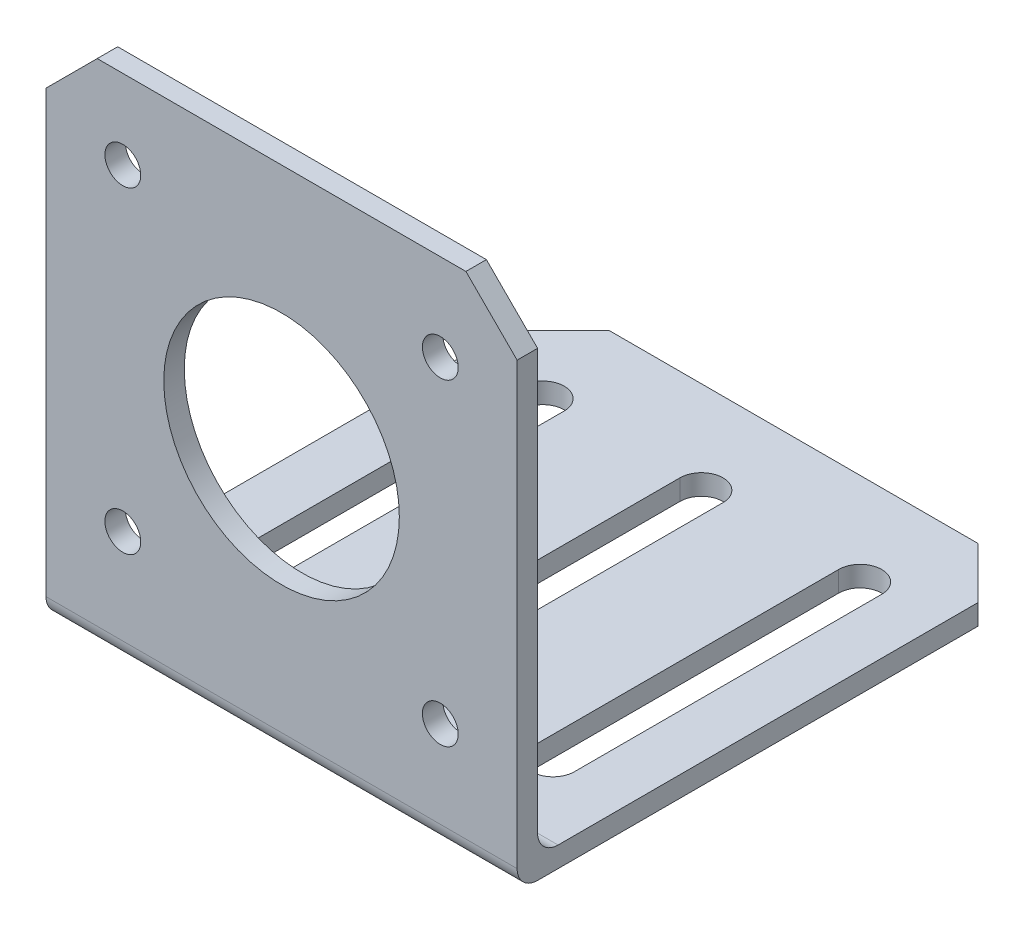
ISO-10303-21;
HEADER;
FILE_DESCRIPTION(('STEP AP214'),'2;1');
FILE_NAME('part.step','',(''),(''),'','','');
FILE_SCHEMA(('AUTOMOTIVE_DESIGN { 1 0 10303 214 1 1 1 1 }'));
ENDSEC;
DATA;
#1=APPLICATION_CONTEXT('core data for automotive mechanical design processes');
#2=APPLICATION_PROTOCOL_DEFINITION('international standard','automotive_design',2000,#1);
#3=PRODUCT_CONTEXT('',#1,'mechanical');
#4=PRODUCT('Part','Part','',(#3));
#5=PRODUCT_RELATED_PRODUCT_CATEGORY('part','',(#4));
#6=PRODUCT_DEFINITION_FORMATION('','',#4);
#7=PRODUCT_DEFINITION_CONTEXT('part definition',#1,'design');
#8=PRODUCT_DEFINITION('design','',#6,#7);
#9=PRODUCT_DEFINITION_SHAPE('','',#8);
#10=(LENGTH_UNIT() NAMED_UNIT(*) SI_UNIT(.MILLI.,.METRE.));
#11=(NAMED_UNIT(*) PLANE_ANGLE_UNIT() SI_UNIT($,.RADIAN.));
#12=(NAMED_UNIT(*) SI_UNIT($,.STERADIAN.) SOLID_ANGLE_UNIT());
#13=UNCERTAINTY_MEASURE_WITH_UNIT(LENGTH_MEASURE(1.E-05),#10,'distance_accuracy_value','');
#14=(GEOMETRIC_REPRESENTATION_CONTEXT(3) GLOBAL_UNCERTAINTY_ASSIGNED_CONTEXT((#13)) GLOBAL_UNIT_ASSIGNED_CONTEXT((#10,
#11,#12)) REPRESENTATION_CONTEXT('',''));
#15=CARTESIAN_POINT('',(0.,0.,0.));
#16=DIRECTION('',(0.,0.,1.));
#17=DIRECTION('',(1.,0.,0.));
#18=AXIS2_PLACEMENT_3D('',#15,#16,#17);
#19=CARTESIAN_POINT('',(46.,2.,-4.));
#20=DIRECTION('',(0.,-1.,0.));
#21=DIRECTION('',(0.,0.,-1.));
#22=AXIS2_PLACEMENT_3D('',#19,#20,#21);
#23=PLANE('',#22);
#24=DIRECTION('',(-1.,0.,0.));
#25=VECTOR('',#24,1.);
#26=CARTESIAN_POINT('',(46.,2.,-50.));
#27=LINE('',#26,#25);
#28=CARTESIAN_POINT('',(41.,2.,-50.));
#29=VERTEX_POINT('',#28);
#30=CARTESIAN_POINT('',(5.,2.,-50.));
#31=VERTEX_POINT('',#30);
#32=EDGE_CURVE('E372',#29,#31,#27,.T.);
#33=ORIENTED_EDGE('',*,*,#32,.T.);
#34=DIRECTION('',(-0.707106781186547,0.,0.707106781186548));
#35=VECTOR('',#34,1.);
#36=CARTESIAN_POINT('',(5.,2.,-50.));
#37=LINE('',#36,#35);
#38=CARTESIAN_POINT('',(0.,2.,-45.));
#39=VERTEX_POINT('',#38);
#40=EDGE_CURVE('E382',#31,#39,#37,.T.);
#41=ORIENTED_EDGE('',*,*,#40,.T.);
#42=DIRECTION('',(0.,0.,1.));
#43=VECTOR('',#42,1.);
#44=CARTESIAN_POINT('',(0.,2.,-4.));
#45=LINE('',#44,#43);
#46=CARTESIAN_POINT('',(0.,2.,-4.));
#47=VERTEX_POINT('',#46);
#48=EDGE_CURVE('E323',#39,#47,#45,.T.);
#49=ORIENTED_EDGE('',*,*,#48,.T.);
#50=DIRECTION('',(-1.,0.,0.));
#51=VECTOR('',#50,1.);
#52=CARTESIAN_POINT('',(46.,2.,-4.));
#53=LINE('',#52,#51);
#54=CARTESIAN_POINT('',(46.,2.,-4.));
#55=VERTEX_POINT('',#54);
#56=EDGE_CURVE('E369',#55,#47,#53,.T.);
#57=ORIENTED_EDGE('',*,*,#56,.F.);
#58=DIRECTION('',(0.,0.,1.));
#59=VECTOR('',#58,1.);
#60=CARTESIAN_POINT('',(46.,2.,-4.));
#61=LINE('',#60,#59);
#62=CARTESIAN_POINT('',(46.,2.,-45.));
#63=VERTEX_POINT('',#62);
#64=EDGE_CURVE('E324',#63,#55,#61,.T.);
#65=ORIENTED_EDGE('',*,*,#64,.F.);
#66=DIRECTION('',(0.707106781186549,0.,0.707106781186547));
#67=VECTOR('',#66,1.);
#68=CARTESIAN_POINT('',(46.,2.,-45.));
#69=LINE('',#68,#67);
#70=EDGE_CURVE('E380',#63,#29,#69,.F.);
#71=ORIENTED_EDGE('',*,*,#70,.T.);
#72=EDGE_LOOP('',(#33,#41,#49,#57,#65,#71));
#73=FACE_BOUND('',#72,.T.);
#74=DIRECTION('',(0.,0.,1.));
#75=VECTOR('',#74,1.);
#76=CARTESIAN_POINT('',(9.6,2.,-4.));
#77=LINE('',#76,#75);
#78=CARTESIAN_POINT('',(9.6,2.,-41.));
#79=VERTEX_POINT('',#78);
#80=CARTESIAN_POINT('',(9.6,2.,-11.));
#81=VERTEX_POINT('',#80);
#82=EDGE_CURVE('E287',#79,#81,#77,.T.);
#83=ORIENTED_EDGE('',*,*,#82,.T.);
#84=CARTESIAN_POINT('',(7.5,2.,-11.));
#85=DIRECTION('',(0.,-1.,0.));
#86=DIRECTION('',(0.,0.,-1.));
#87=AXIS2_PLACEMENT_3D('',#84,#85,#86);
#88=CIRCLE('',#87,2.1);
#89=CARTESIAN_POINT('',(5.4,2.,-11.));
#90=VERTEX_POINT('',#89);
#91=EDGE_CURVE('E290',#81,#90,#88,.T.);
#92=ORIENTED_EDGE('',*,*,#91,.T.);
#93=DIRECTION('',(0.,0.,-1.));
#94=VECTOR('',#93,1.);
#95=CARTESIAN_POINT('',(5.4,2.,-4.));
#96=LINE('',#95,#94);
#97=CARTESIAN_POINT('',(5.4,2.,-41.));
#98=VERTEX_POINT('',#97);
#99=EDGE_CURVE('E275',#90,#98,#96,.T.);
#100=ORIENTED_EDGE('',*,*,#99,.T.);
#101=CARTESIAN_POINT('',(7.5,2.,-41.));
#102=DIRECTION('',(0.,-1.,0.));
#103=DIRECTION('',(0.,0.,-1.));
#104=AXIS2_PLACEMENT_3D('',#101,#102,#103);
#105=CIRCLE('',#104,2.1);
#106=EDGE_CURVE('E284',#98,#79,#105,.T.);
#107=ORIENTED_EDGE('',*,*,#106,.T.);
#108=EDGE_LOOP('',(#83,#92,#100,#107));
#109=FACE_BOUND('',#108,.T.);
#110=DIRECTION('',(0.,0.,1.));
#111=VECTOR('',#110,1.);
#112=CARTESIAN_POINT('',(40.6,2.,-4.));
#113=LINE('',#112,#111);
#114=CARTESIAN_POINT('',(40.6,2.,-41.));
#115=VERTEX_POINT('',#114);
#116=CARTESIAN_POINT('',(40.6,2.,-11.));
#117=VERTEX_POINT('',#116);
#118=EDGE_CURVE('E255',#115,#117,#113,.T.);
#119=ORIENTED_EDGE('',*,*,#118,.T.);
#120=CARTESIAN_POINT('',(38.5,2.,-11.));
#121=DIRECTION('',(0.,-1.,0.));
#122=DIRECTION('',(0.,0.,-1.));
#123=AXIS2_PLACEMENT_3D('',#120,#121,#122);
#124=CIRCLE('',#123,2.1);
#125=CARTESIAN_POINT('',(36.4,2.,-11.));
#126=VERTEX_POINT('',#125);
#127=EDGE_CURVE('E258',#117,#126,#124,.T.);
#128=ORIENTED_EDGE('',*,*,#127,.T.);
#129=DIRECTION('',(0.,0.,-1.));
#130=VECTOR('',#129,1.);
#131=CARTESIAN_POINT('',(36.4,2.,-4.));
#132=LINE('',#131,#130);
#133=CARTESIAN_POINT('',(36.4,2.,-41.));
#134=VERTEX_POINT('',#133);
#135=EDGE_CURVE('E243',#126,#134,#132,.T.);
#136=ORIENTED_EDGE('',*,*,#135,.T.);
#137=CARTESIAN_POINT('',(38.5,2.,-41.));
#138=DIRECTION('',(0.,-1.,0.));
#139=DIRECTION('',(0.,0.,-1.));
#140=AXIS2_PLACEMENT_3D('',#137,#138,#139);
#141=CIRCLE('',#140,2.1);
#142=EDGE_CURVE('E252',#134,#115,#141,.T.);
#143=ORIENTED_EDGE('',*,*,#142,.T.);
#144=EDGE_LOOP('',(#119,#128,#136,#143));
#145=FACE_BOUND('',#144,.T.);
#146=CARTESIAN_POINT('',(23.,2.,-11.));
#147=DIRECTION('',(0.,-1.,0.));
#148=DIRECTION('',(0.,0.,-1.));
#149=AXIS2_PLACEMENT_3D('',#146,#147,#148);
#150=CIRCLE('',#149,2.1);
#151=CARTESIAN_POINT('',(20.9,2.,-11.));
#152=VERTEX_POINT('',#151);
#153=CARTESIAN_POINT('',(25.1,2.,-11.));
#154=VERTEX_POINT('',#153);
#155=EDGE_CURVE('E197',#152,#154,#150,.F.);
#156=ORIENTED_EDGE('',*,*,#155,.F.);
#157=DIRECTION('',(0.,0.,1.));
#158=VECTOR('',#157,1.);
#159=CARTESIAN_POINT('',(20.9,2.,-4.));
#160=LINE('',#159,#158);
#161=CARTESIAN_POINT('',(20.9,2.,-41.));
#162=VERTEX_POINT('',#161);
#163=EDGE_CURVE('E200',#162,#152,#160,.T.);
#164=ORIENTED_EDGE('',*,*,#163,.F.);
#165=CARTESIAN_POINT('',(23.,2.,-41.));
#166=DIRECTION('',(0.,-1.,0.));
#167=DIRECTION('',(0.,0.,-1.));
#168=AXIS2_PLACEMENT_3D('',#165,#166,#167);
#169=CIRCLE('',#168,2.1);
#170=CARTESIAN_POINT('',(25.1,2.,-41.));
#171=VERTEX_POINT('',#170);
#172=EDGE_CURVE('E224',#171,#162,#169,.F.);
#173=ORIENTED_EDGE('',*,*,#172,.F.);
#174=DIRECTION('',(0.,0.,-1.));
#175=VECTOR('',#174,1.);
#176=CARTESIAN_POINT('',(25.1,2.,-4.));
#177=LINE('',#176,#175);
#178=EDGE_CURVE('E226',#154,#171,#177,.T.);
#179=ORIENTED_EDGE('',*,*,#178,.F.);
#180=EDGE_LOOP('',(#156,#164,#173,#179));
#181=FACE_BOUND('',#180,.T.);
#182=ADVANCED_FACE('F34',(#73,#109,#145,#181),#23,.F.);
#183=CARTESIAN_POINT('',(46.,0.,-2.00000000000001));
#184=DIRECTION('',(0.,1.,0.));
#185=DIRECTION('',(0.,0.,1.));
#186=AXIS2_PLACEMENT_3D('',#183,#184,#185);
#187=PLANE('',#186);
#188=DIRECTION('',(0.,0.,-1.));
#189=VECTOR('',#188,1.);
#190=CARTESIAN_POINT('',(0.,0.,-2.00000000000001));
#191=LINE('',#190,#189);
#192=CARTESIAN_POINT('',(0.,0.,-2.00000000000001));
#193=VERTEX_POINT('',#192);
#194=CARTESIAN_POINT('',(0.,0.,-45.));
#195=VERTEX_POINT('',#194);
#196=EDGE_CURVE('E327',#193,#195,#191,.T.);
#197=ORIENTED_EDGE('',*,*,#196,.T.);
#198=DIRECTION('',(0.707106781186547,0.,-0.707106781186548));
#199=VECTOR('',#198,1.);
#200=CARTESIAN_POINT('',(5.,0.,-50.));
#201=LINE('',#200,#199);
#202=CARTESIAN_POINT('',(5.,0.,-50.));
#203=VERTEX_POINT('',#202);
#204=EDGE_CURVE('E390',#195,#203,#201,.T.);
#205=ORIENTED_EDGE('',*,*,#204,.T.);
#206=DIRECTION('',(-1.,0.,0.));
#207=VECTOR('',#206,1.);
#208=CARTESIAN_POINT('',(46.,0.,-50.));
#209=LINE('',#208,#207);
#210=CARTESIAN_POINT('',(41.,0.,-50.));
#211=VERTEX_POINT('',#210);
#212=EDGE_CURVE('E339',#211,#203,#209,.T.);
#213=ORIENTED_EDGE('',*,*,#212,.F.);
#214=DIRECTION('',(-0.707106781186549,0.,-0.707106781186547));
#215=VECTOR('',#214,1.);
#216=CARTESIAN_POINT('',(46.,0.,-45.));
#217=LINE('',#216,#215);
#218=CARTESIAN_POINT('',(46.,0.,-45.));
#219=VERTEX_POINT('',#218);
#220=EDGE_CURVE('E388',#211,#219,#217,.F.);
#221=ORIENTED_EDGE('',*,*,#220,.T.);
#222=DIRECTION('',(0.,0.,-1.));
#223=VECTOR('',#222,1.);
#224=CARTESIAN_POINT('',(46.,0.,-2.00000000000001));
#225=LINE('',#224,#223);
#226=CARTESIAN_POINT('',(46.,0.,-2.00000000000001));
#227=VERTEX_POINT('',#226);
#228=EDGE_CURVE('E336',#227,#219,#225,.T.);
#229=ORIENTED_EDGE('',*,*,#228,.F.);
#230=DIRECTION('',(-1.,0.,0.));
#231=VECTOR('',#230,1.);
#232=CARTESIAN_POINT('',(46.,0.,-2.00000000000001));
#233=LINE('',#232,#231);
#234=EDGE_CURVE('E354',#227,#193,#233,.T.);
#235=ORIENTED_EDGE('',*,*,#234,.T.);
#236=EDGE_LOOP('',(#197,#205,#213,#221,#229,#235));
#237=FACE_BOUND('',#236,.T.);
#238=DIRECTION('',(0.,0.,-1.));
#239=VECTOR('',#238,1.);
#240=CARTESIAN_POINT('',(5.4,0.,-11.));
#241=LINE('',#240,#239);
#242=CARTESIAN_POINT('',(5.4,0.,-11.));
#243=VERTEX_POINT('',#242);
#244=CARTESIAN_POINT('',(5.4,0.,-41.));
#245=VERTEX_POINT('',#244);
#246=EDGE_CURVE('E263',#243,#245,#241,.T.);
#247=ORIENTED_EDGE('',*,*,#246,.F.);
#248=CARTESIAN_POINT('',(7.5,0.,-11.));
#249=DIRECTION('',(0.,-1.,0.));
#250=DIRECTION('',(0.,0.,-1.));
#251=AXIS2_PLACEMENT_3D('',#248,#249,#250);
#252=CIRCLE('',#251,2.1);
#253=CARTESIAN_POINT('',(9.6,0.,-11.));
#254=VERTEX_POINT('',#253);
#255=EDGE_CURVE('E261',#254,#243,#252,.T.);
#256=ORIENTED_EDGE('',*,*,#255,.F.);
#257=DIRECTION('',(0.,0.,1.));
#258=VECTOR('',#257,1.);
#259=CARTESIAN_POINT('',(9.6,0.,-11.));
#260=LINE('',#259,#258);
#261=CARTESIAN_POINT('',(9.6,0.,-41.));
#262=VERTEX_POINT('',#261);
#263=EDGE_CURVE('E269',#262,#254,#260,.T.);
#264=ORIENTED_EDGE('',*,*,#263,.F.);
#265=CARTESIAN_POINT('',(7.5,0.,-41.));
#266=DIRECTION('',(0.,-1.,0.));
#267=DIRECTION('',(0.,0.,-1.));
#268=AXIS2_PLACEMENT_3D('',#265,#266,#267);
#269=CIRCLE('',#268,2.1);
#270=EDGE_CURVE('E266',#245,#262,#269,.T.);
#271=ORIENTED_EDGE('',*,*,#270,.F.);
#272=EDGE_LOOP('',(#247,#256,#264,#271));
#273=FACE_BOUND('',#272,.T.);
#274=DIRECTION('',(0.,0.,-1.));
#275=VECTOR('',#274,1.);
#276=CARTESIAN_POINT('',(36.4,0.,-11.));
#277=LINE('',#276,#275);
#278=CARTESIAN_POINT('',(36.4,0.,-11.));
#279=VERTEX_POINT('',#278);
#280=CARTESIAN_POINT('',(36.4,0.,-41.));
#281=VERTEX_POINT('',#280);
#282=EDGE_CURVE('E231',#279,#281,#277,.T.);
#283=ORIENTED_EDGE('',*,*,#282,.F.);
#284=CARTESIAN_POINT('',(38.5,0.,-11.));
#285=DIRECTION('',(0.,-1.,0.));
#286=DIRECTION('',(0.,0.,-1.));
#287=AXIS2_PLACEMENT_3D('',#284,#285,#286);
#288=CIRCLE('',#287,2.1);
#289=CARTESIAN_POINT('',(40.6,0.,-11.));
#290=VERTEX_POINT('',#289);
#291=EDGE_CURVE('E229',#290,#279,#288,.T.);
#292=ORIENTED_EDGE('',*,*,#291,.F.);
#293=DIRECTION('',(0.,0.,1.));
#294=VECTOR('',#293,1.);
#295=CARTESIAN_POINT('',(40.6,0.,-11.));
#296=LINE('',#295,#294);
#297=CARTESIAN_POINT('',(40.6,0.,-41.));
#298=VERTEX_POINT('',#297);
#299=EDGE_CURVE('E237',#298,#290,#296,.T.);
#300=ORIENTED_EDGE('',*,*,#299,.F.);
#301=CARTESIAN_POINT('',(38.5,0.,-41.));
#302=DIRECTION('',(0.,-1.,0.));
#303=DIRECTION('',(0.,0.,-1.));
#304=AXIS2_PLACEMENT_3D('',#301,#302,#303);
#305=CIRCLE('',#304,2.1);
#306=EDGE_CURVE('E234',#281,#298,#305,.T.);
#307=ORIENTED_EDGE('',*,*,#306,.F.);
#308=EDGE_LOOP('',(#283,#292,#300,#307));
#309=FACE_BOUND('',#308,.T.);
#310=CARTESIAN_POINT('',(23.,0.,-11.));
#311=DIRECTION('',(0.,1.,0.));
#312=DIRECTION('',(0.,0.,1.));
#313=AXIS2_PLACEMENT_3D('',#310,#311,#312);
#314=CIRCLE('',#313,2.1);
#315=CARTESIAN_POINT('',(20.9,0.,-11.));
#316=VERTEX_POINT('',#315);
#317=CARTESIAN_POINT('',(25.1,0.,-11.));
#318=VERTEX_POINT('',#317);
#319=EDGE_CURVE('E57',#316,#318,#314,.T.);
#320=ORIENTED_EDGE('',*,*,#319,.T.);
#321=DIRECTION('',(0.,0.,-1.));
#322=VECTOR('',#321,1.);
#323=CARTESIAN_POINT('',(25.1,0.,-11.));
#324=LINE('',#323,#322);
#325=CARTESIAN_POINT('',(25.1,0.,-41.));
#326=VERTEX_POINT('',#325);
#327=EDGE_CURVE('E204',#318,#326,#324,.T.);
#328=ORIENTED_EDGE('',*,*,#327,.T.);
#329=CARTESIAN_POINT('',(23.,0.,-41.));
#330=DIRECTION('',(0.,1.,0.));
#331=DIRECTION('',(0.,0.,1.));
#332=AXIS2_PLACEMENT_3D('',#329,#330,#331);
#333=CIRCLE('',#332,2.1);
#334=CARTESIAN_POINT('',(20.9,0.,-41.));
#335=VERTEX_POINT('',#334);
#336=EDGE_CURVE('E210',#326,#335,#333,.T.);
#337=ORIENTED_EDGE('',*,*,#336,.T.);
#338=DIRECTION('',(0.,0.,1.));
#339=VECTOR('',#338,1.);
#340=CARTESIAN_POINT('',(20.9,0.,-41.));
#341=LINE('',#340,#339);
#342=EDGE_CURVE('E214',#335,#316,#341,.T.);
#343=ORIENTED_EDGE('',*,*,#342,.T.);
#344=EDGE_LOOP('',(#320,#328,#337,#343));
#345=FACE_BOUND('',#344,.T.);
#346=ADVANCED_FACE('F213',(#237,#273,#309,#345),#187,.F.);
#347=CARTESIAN_POINT('',(46.,0.,-50.));
#348=DIRECTION('',(0.,0.,1.));
#349=DIRECTION('',(1.,0.,0.));
#350=AXIS2_PLACEMENT_3D('',#347,#348,#349);
#351=PLANE('',#350);
#352=ORIENTED_EDGE('',*,*,#212,.T.);
#353=DIRECTION('',(0.,1.,0.));
#354=VECTOR('',#353,1.);
#355=CARTESIAN_POINT('',(5.,2.,-50.));
#356=LINE('',#355,#354);
#357=EDGE_CURVE('E377',#203,#31,#356,.T.);
#358=ORIENTED_EDGE('',*,*,#357,.T.);
#359=ORIENTED_EDGE('',*,*,#32,.F.);
#360=DIRECTION('',(0.,-1.,0.));
#361=VECTOR('',#360,1.);
#362=CARTESIAN_POINT('',(41.,0.,-50.));
#363=LINE('',#362,#361);
#364=EDGE_CURVE('E375',#29,#211,#363,.T.);
#365=ORIENTED_EDGE('',*,*,#364,.T.);
#366=EDGE_LOOP('',(#352,#358,#359,#365));
#367=FACE_BOUND('',#366,.T.);
#368=ADVANCED_FACE('F451',(#367),#351,.F.);
#369=CARTESIAN_POINT('',(46.,4.,-4.));
#370=DIRECTION('',(-1.,0.,0.));
#371=DIRECTION('',(0.,0.,1.));
#372=AXIS2_PLACEMENT_3D('',#369,#370,#371);
#373=CYLINDRICAL_SURFACE('',#372,2.);
#374=CARTESIAN_POINT('',(0.,4.,-4.));
#375=DIRECTION('',(-1.,0.,0.));
#376=DIRECTION('',(0.,0.,1.));
#377=AXIS2_PLACEMENT_3D('',#374,#375,#376);
#378=CIRCLE('',#377,2.);
#379=CARTESIAN_POINT('',(0.,4.,-2.));
#380=VERTEX_POINT('',#379);
#381=EDGE_CURVE('E341',#47,#380,#378,.T.);
#382=ORIENTED_EDGE('',*,*,#381,.T.);
#383=DIRECTION('',(-1.,0.,0.));
#384=VECTOR('',#383,1.);
#385=CARTESIAN_POINT('',(46.,4.,-2.));
#386=LINE('',#385,#384);
#387=CARTESIAN_POINT('',(46.,4.,-2.));
#388=VERTEX_POINT('',#387);
#389=EDGE_CURVE('E366',#388,#380,#386,.T.);
#390=ORIENTED_EDGE('',*,*,#389,.F.);
#391=CARTESIAN_POINT('',(46.,4.,-4.));
#392=DIRECTION('',(-1.,0.,0.));
#393=DIRECTION('',(0.,0.,1.));
#394=AXIS2_PLACEMENT_3D('',#391,#392,#393);
#395=CIRCLE('',#394,2.);
#396=EDGE_CURVE('E326',#55,#388,#395,.T.);
#397=ORIENTED_EDGE('',*,*,#396,.F.);
#398=ORIENTED_EDGE('',*,*,#56,.T.);
#399=EDGE_LOOP('',(#382,#390,#397,#398));
#400=FACE_BOUND('',#399,.T.);
#401=ADVANCED_FACE('F459',(#400),#373,.F.);
#402=CARTESIAN_POINT('',(46.,4.,-2.));
#403=DIRECTION('',(0.,0.,1.));
#404=DIRECTION('',(1.,0.,0.));
#405=AXIS2_PLACEMENT_3D('',#402,#403,#404);
#406=PLANE('',#405);
#407=CARTESIAN_POINT('',(38.5,10.5,-2.));
#408=DIRECTION('',(0.,0.,1.));
#409=DIRECTION('',(1.,0.,0.));
#410=AXIS2_PLACEMENT_3D('',#407,#408,#409);
#411=CIRCLE('',#410,1.75);
#412=CARTESIAN_POINT('',(40.25,10.5,-2.));
#413=VERTEX_POINT('',#412);
#414=EDGE_CURVE('E296',#413,#413,#411,.T.);
#415=ORIENTED_EDGE('',*,*,#414,.T.);
#416=EDGE_LOOP('',(#415));
#417=FACE_BOUND('',#416,.T.);
#418=CARTESIAN_POINT('',(7.5,11.25,-2.));
#419=DIRECTION('',(0.,0.,1.));
#420=DIRECTION('',(1.,0.,0.));
#421=AXIS2_PLACEMENT_3D('',#418,#419,#420);
#422=CIRCLE('',#421,1.75);
#423=CARTESIAN_POINT('',(9.25000000000001,11.25,-2.));
#424=VERTEX_POINT('',#423);
#425=EDGE_CURVE('E302',#424,#424,#422,.T.);
#426=ORIENTED_EDGE('',*,*,#425,.T.);
#427=EDGE_LOOP('',(#426));
#428=FACE_BOUND('',#427,.T.);
#429=CARTESIAN_POINT('',(38.5,41.5,-2.));
#430=DIRECTION('',(0.,0.,1.));
#431=DIRECTION('',(1.,0.,0.));
#432=AXIS2_PLACEMENT_3D('',#429,#430,#431);
#433=CIRCLE('',#432,1.75);
#434=CARTESIAN_POINT('',(40.25,41.5,-2.));
#435=VERTEX_POINT('',#434);
#436=EDGE_CURVE('E308',#435,#435,#433,.T.);
#437=ORIENTED_EDGE('',*,*,#436,.T.);
#438=EDGE_LOOP('',(#437));
#439=FACE_BOUND('',#438,.T.);
#440=CARTESIAN_POINT('',(7.5,42.25,-2.));
#441=DIRECTION('',(0.,0.,1.));
#442=DIRECTION('',(1.,0.,0.));
#443=AXIS2_PLACEMENT_3D('',#440,#441,#442);
#444=CIRCLE('',#443,1.75);
#445=CARTESIAN_POINT('',(9.25,42.25,-2.));
#446=VERTEX_POINT('',#445);
#447=EDGE_CURVE('E314',#446,#446,#444,.T.);
#448=ORIENTED_EDGE('',*,*,#447,.T.);
#449=EDGE_LOOP('',(#448));
#450=FACE_BOUND('',#449,.T.);
#451=CARTESIAN_POINT('',(23.,26.,-2.));
#452=DIRECTION('',(0.,0.,1.));
#453=DIRECTION('',(1.,0.,0.));
#454=AXIS2_PLACEMENT_3D('',#451,#452,#453);
#455=CIRCLE('',#454,11.5);
#456=CARTESIAN_POINT('',(34.5,26.,-2.));
#457=VERTEX_POINT('',#456);
#458=EDGE_CURVE('E320',#457,#457,#455,.T.);
#459=ORIENTED_EDGE('',*,*,#458,.T.);
#460=EDGE_LOOP('',(#459));
#461=FACE_BOUND('',#460,.T.);
#462=DIRECTION('',(-1.,0.,0.));
#463=VECTOR('',#462,1.);
#464=CARTESIAN_POINT('',(46.,50.,-2.));
#465=LINE('',#464,#463);
#466=CARTESIAN_POINT('',(41.,50.,-2.));
#467=VERTEX_POINT('',#466);
#468=CARTESIAN_POINT('',(5.,50.,-2.));
#469=VERTEX_POINT('',#468);
#470=EDGE_CURVE('E363',#467,#469,#465,.T.);
#471=ORIENTED_EDGE('',*,*,#470,.F.);
#472=DIRECTION('',(-0.707106781186549,0.707106781186547,0.));
#473=VECTOR('',#472,1.);
#474=CARTESIAN_POINT('',(46.,45.,-2.));
#475=LINE('',#474,#473);
#476=CARTESIAN_POINT('',(46.,45.,-2.));
#477=VERTEX_POINT('',#476);
#478=EDGE_CURVE('E11',#467,#477,#475,.F.);
#479=ORIENTED_EDGE('',*,*,#478,.T.);
#480=DIRECTION('',(0.,1.,0.));
#481=VECTOR('',#480,1.);
#482=CARTESIAN_POINT('',(46.,4.,-2.));
#483=LINE('',#482,#481);
#484=EDGE_CURVE('E329',#388,#477,#483,.T.);
#485=ORIENTED_EDGE('',*,*,#484,.F.);
#486=ORIENTED_EDGE('',*,*,#389,.T.);
#487=DIRECTION('',(0.,1.,0.));
#488=VECTOR('',#487,1.);
#489=CARTESIAN_POINT('',(0.,4.,-2.));
#490=LINE('',#489,#488);
#491=CARTESIAN_POINT('',(0.,45.,-2.));
#492=VERTEX_POINT('',#491);
#493=EDGE_CURVE('E343',#380,#492,#490,.T.);
#494=ORIENTED_EDGE('',*,*,#493,.T.);
#495=DIRECTION('',(0.707106781186547,0.707106781186548,0.));
#496=VECTOR('',#495,1.);
#497=CARTESIAN_POINT('',(5.,50.,-2.));
#498=LINE('',#497,#496);
#499=EDGE_CURVE('E42',#492,#469,#498,.T.);
#500=ORIENTED_EDGE('',*,*,#499,.T.);
#501=EDGE_LOOP('',(#471,#479,#485,#486,#494,#500));
#502=FACE_BOUND('',#501,.T.);
#503=ADVANCED_FACE('F409',(#417,#428,#439,#450,#461,#502),#406,.F.);
#504=CARTESIAN_POINT('',(46.,50.,0.));
#505=DIRECTION('',(0.,-1.,0.));
#506=DIRECTION('',(0.,0.,-1.));
#507=AXIS2_PLACEMENT_3D('',#504,#505,#506);
#508=PLANE('',#507);
#509=DIRECTION('',(-1.,0.,0.));
#510=VECTOR('',#509,1.);
#511=CARTESIAN_POINT('',(46.,50.,0.));
#512=LINE('',#511,#510);
#513=CARTESIAN_POINT('',(41.,50.,0.));
#514=VERTEX_POINT('',#513);
#515=CARTESIAN_POINT('',(5.,50.,0.));
#516=VERTEX_POINT('',#515);
#517=EDGE_CURVE('E360',#514,#516,#512,.T.);
#518=ORIENTED_EDGE('',*,*,#517,.F.);
#519=DIRECTION('',(0.,0.,-1.));
#520=VECTOR('',#519,1.);
#521=CARTESIAN_POINT('',(41.,50.,0.));
#522=LINE('',#521,#520);
#523=EDGE_CURVE('E405',#514,#467,#522,.T.);
#524=ORIENTED_EDGE('',*,*,#523,.T.);
#525=ORIENTED_EDGE('',*,*,#470,.T.);
#526=DIRECTION('',(0.,0.,1.));
#527=VECTOR('',#526,1.);
#528=CARTESIAN_POINT('',(5.,50.,0.));
#529=LINE('',#528,#527);
#530=EDGE_CURVE('E402',#469,#516,#529,.T.);
#531=ORIENTED_EDGE('',*,*,#530,.T.);
#532=EDGE_LOOP('',(#518,#524,#525,#531));
#533=FACE_BOUND('',#532,.T.);
#534=ADVANCED_FACE('F417',(#533),#508,.F.);
#535=CARTESIAN_POINT('',(46.,2.00000000000001,0.));
#536=DIRECTION('',(0.,0.,-1.));
#537=DIRECTION('',(-1.,0.,0.));
#538=AXIS2_PLACEMENT_3D('',#535,#536,#537);
#539=PLANE('',#538);
#540=CARTESIAN_POINT('',(38.5,10.5,0.));
#541=DIRECTION('',(0.,0.,1.));
#542=DIRECTION('',(1.,0.,0.));
#543=AXIS2_PLACEMENT_3D('',#540,#541,#542);
#544=CIRCLE('',#543,1.75);
#545=CARTESIAN_POINT('',(40.25,10.5,0.));
#546=VERTEX_POINT('',#545);
#547=EDGE_CURVE('E293',#546,#546,#544,.T.);
#548=ORIENTED_EDGE('',*,*,#547,.F.);
#549=EDGE_LOOP('',(#548));
#550=FACE_BOUND('',#549,.T.);
#551=CARTESIAN_POINT('',(7.5,11.25,0.));
#552=DIRECTION('',(0.,0.,1.));
#553=DIRECTION('',(1.,0.,0.));
#554=AXIS2_PLACEMENT_3D('',#551,#552,#553);
#555=CIRCLE('',#554,1.75);
#556=CARTESIAN_POINT('',(9.25000000000001,11.25,0.));
#557=VERTEX_POINT('',#556);
#558=EDGE_CURVE('E299',#557,#557,#555,.T.);
#559=ORIENTED_EDGE('',*,*,#558,.F.);
#560=EDGE_LOOP('',(#559));
#561=FACE_BOUND('',#560,.T.);
#562=CARTESIAN_POINT('',(38.5,41.5,0.));
#563=DIRECTION('',(0.,0.,1.));
#564=DIRECTION('',(1.,0.,0.));
#565=AXIS2_PLACEMENT_3D('',#562,#563,#564);
#566=CIRCLE('',#565,1.75);
#567=CARTESIAN_POINT('',(40.25,41.5,0.));
#568=VERTEX_POINT('',#567);
#569=EDGE_CURVE('E305',#568,#568,#566,.T.);
#570=ORIENTED_EDGE('',*,*,#569,.F.);
#571=EDGE_LOOP('',(#570));
#572=FACE_BOUND('',#571,.T.);
#573=CARTESIAN_POINT('',(7.5,42.25,0.));
#574=DIRECTION('',(0.,0.,1.));
#575=DIRECTION('',(1.,0.,0.));
#576=AXIS2_PLACEMENT_3D('',#573,#574,#575);
#577=CIRCLE('',#576,1.75);
#578=CARTESIAN_POINT('',(9.25,42.25,0.));
#579=VERTEX_POINT('',#578);
#580=EDGE_CURVE('E311',#579,#579,#577,.T.);
#581=ORIENTED_EDGE('',*,*,#580,.F.);
#582=EDGE_LOOP('',(#581));
#583=FACE_BOUND('',#582,.T.);
#584=CARTESIAN_POINT('',(23.,26.,0.));
#585=DIRECTION('',(0.,0.,1.));
#586=DIRECTION('',(1.,0.,0.));
#587=AXIS2_PLACEMENT_3D('',#584,#585,#586);
#588=CIRCLE('',#587,11.5);
#589=CARTESIAN_POINT('',(34.5,26.,0.));
#590=VERTEX_POINT('',#589);
#591=EDGE_CURVE('E317',#590,#590,#588,.T.);
#592=ORIENTED_EDGE('',*,*,#591,.F.);
#593=EDGE_LOOP('',(#592));
#594=FACE_BOUND('',#593,.T.);
#595=DIRECTION('',(0.,-1.,0.));
#596=VECTOR('',#595,1.);
#597=CARTESIAN_POINT('',(46.,2.00000000000001,0.));
#598=LINE('',#597,#596);
#599=CARTESIAN_POINT('',(46.,45.,0.));
#600=VERTEX_POINT('',#599);
#601=CARTESIAN_POINT('',(46.,2.00000000000001,0.));
#602=VERTEX_POINT('',#601);
#603=EDGE_CURVE('E332',#600,#602,#598,.T.);
#604=ORIENTED_EDGE('',*,*,#603,.F.);
#605=DIRECTION('',(0.707106781186549,-0.707106781186547,0.));
#606=VECTOR('',#605,1.);
#607=CARTESIAN_POINT('',(46.,45.,0.));
#608=LINE('',#607,#606);
#609=EDGE_CURVE('E400',#600,#514,#608,.F.);
#610=ORIENTED_EDGE('',*,*,#609,.T.);
#611=ORIENTED_EDGE('',*,*,#517,.T.);
#612=DIRECTION('',(-0.707106781186547,-0.707106781186548,0.));
#613=VECTOR('',#612,1.);
#614=CARTESIAN_POINT('',(5.,50.,0.));
#615=LINE('',#614,#613);
#616=CARTESIAN_POINT('',(0.,45.,0.));
#617=VERTEX_POINT('',#616);
#618=EDGE_CURVE('E398',#516,#617,#615,.T.);
#619=ORIENTED_EDGE('',*,*,#618,.T.);
#620=DIRECTION('',(0.,-1.,0.));
#621=VECTOR('',#620,1.);
#622=CARTESIAN_POINT('',(0.,2.00000000000001,0.));
#623=LINE('',#622,#621);
#624=CARTESIAN_POINT('',(0.,2.00000000000001,0.));
#625=VERTEX_POINT('',#624);
#626=EDGE_CURVE('E346',#617,#625,#623,.T.);
#627=ORIENTED_EDGE('',*,*,#626,.T.);
#628=DIRECTION('',(-1.,0.,0.));
#629=VECTOR('',#628,1.);
#630=CARTESIAN_POINT('',(46.,2.00000000000001,0.));
#631=LINE('',#630,#629);
#632=EDGE_CURVE('E357',#602,#625,#631,.T.);
#633=ORIENTED_EDGE('',*,*,#632,.F.);
#634=EDGE_LOOP('',(#604,#610,#611,#619,#627,#633));
#635=FACE_BOUND('',#634,.T.);
#636=ADVANCED_FACE('F422',(#550,#561,#572,#583,#594,#635),#539,.F.);
#637=CARTESIAN_POINT('',(46.,2.,-2.));
#638=DIRECTION('',(-1.,0.,0.));
#639=DIRECTION('',(0.,0.,1.));
#640=AXIS2_PLACEMENT_3D('',#637,#638,#639);
#641=CYLINDRICAL_SURFACE('',#640,2.);
#642=CARTESIAN_POINT('',(0.,2.,-2.));
#643=DIRECTION('',(1.,0.,0.));
#644=DIRECTION('',(0.,0.,1.));
#645=AXIS2_PLACEMENT_3D('',#642,#643,#644);
#646=CIRCLE('',#645,2.);
#647=EDGE_CURVE('E348',#625,#193,#646,.T.);
#648=ORIENTED_EDGE('',*,*,#647,.T.);
#649=ORIENTED_EDGE('',*,*,#234,.F.);
#650=CARTESIAN_POINT('',(46.,2.,-2.));
#651=DIRECTION('',(1.,0.,0.));
#652=DIRECTION('',(0.,0.,1.));
#653=AXIS2_PLACEMENT_3D('',#650,#651,#652);
#654=CIRCLE('',#653,2.);
#655=EDGE_CURVE('E334',#602,#227,#654,.T.);
#656=ORIENTED_EDGE('',*,*,#655,.F.);
#657=ORIENTED_EDGE('',*,*,#632,.T.);
#658=EDGE_LOOP('',(#648,#649,#656,#657));
#659=FACE_BOUND('',#658,.T.);
#660=ADVANCED_FACE('F431',(#659),#641,.T.);
#661=CARTESIAN_POINT('',(46.,4.,-4.));
#662=DIRECTION('',(-1.,0.,0.));
#663=DIRECTION('',(0.,0.,1.));
#664=AXIS2_PLACEMENT_3D('',#661,#662,#663);
#665=PLANE('',#664);
#666=ORIENTED_EDGE('',*,*,#228,.T.);
#667=DIRECTION('',(0.,1.,0.));
#668=VECTOR('',#667,1.);
#669=CARTESIAN_POINT('',(46.,4.,-45.));
#670=LINE('',#669,#668);
#671=EDGE_CURVE('E395',#219,#63,#670,.T.);
#672=ORIENTED_EDGE('',*,*,#671,.T.);
#673=ORIENTED_EDGE('',*,*,#64,.T.);
#674=ORIENTED_EDGE('',*,*,#396,.T.);
#675=ORIENTED_EDGE('',*,*,#484,.T.);
#676=DIRECTION('',(0.,0.,1.));
#677=VECTOR('',#676,1.);
#678=CARTESIAN_POINT('',(46.,45.,-4.));
#679=LINE('',#678,#677);
#680=EDGE_CURVE('E392',#477,#600,#679,.T.);
#681=ORIENTED_EDGE('',*,*,#680,.T.);
#682=ORIENTED_EDGE('',*,*,#603,.T.);
#683=ORIENTED_EDGE('',*,*,#655,.T.);
#684=EDGE_LOOP('',(#666,#672,#673,#674,#675,#681,#682,#683));
#685=FACE_BOUND('',#684,.T.);
#686=ADVANCED_FACE('F441',(#685),#665,.F.);
#687=CARTESIAN_POINT('',(0.,4.,-4.));
#688=DIRECTION('',(-1.,0.,0.));
#689=DIRECTION('',(0.,0.,1.));
#690=AXIS2_PLACEMENT_3D('',#687,#688,#689);
#691=PLANE('',#690);
#692=ORIENTED_EDGE('',*,*,#48,.F.);
#693=DIRECTION('',(0.,-1.,0.));
#694=VECTOR('',#693,1.);
#695=CARTESIAN_POINT('',(0.,0.,-45.));
#696=LINE('',#695,#694);
#697=EDGE_CURVE('E386',#39,#195,#696,.T.);
#698=ORIENTED_EDGE('',*,*,#697,.T.);
#699=ORIENTED_EDGE('',*,*,#196,.F.);
#700=ORIENTED_EDGE('',*,*,#647,.F.);
#701=ORIENTED_EDGE('',*,*,#626,.F.);
#702=DIRECTION('',(0.,0.,-1.));
#703=VECTOR('',#702,1.);
#704=CARTESIAN_POINT('',(0.,45.,-2.));
#705=LINE('',#704,#703);
#706=EDGE_CURVE('E384',#617,#492,#705,.T.);
#707=ORIENTED_EDGE('',*,*,#706,.T.);
#708=ORIENTED_EDGE('',*,*,#493,.F.);
#709=ORIENTED_EDGE('',*,*,#381,.F.);
#710=EDGE_LOOP('',(#692,#698,#699,#700,#701,#707,#708,#709));
#711=FACE_BOUND('',#710,.T.);
#712=ADVANCED_FACE('F427',(#711),#691,.T.);
#713=CARTESIAN_POINT('',(23.,26.,-50.));
#714=DIRECTION('',(0.,0.,1.));
#715=DIRECTION('',(1.,0.,0.));
#716=AXIS2_PLACEMENT_3D('',#713,#714,#715);
#717=CYLINDRICAL_SURFACE('',#716,11.5);
#718=ORIENTED_EDGE('',*,*,#591,.T.);
#719=EDGE_LOOP('',(#718));
#720=FACE_BOUND('',#719,.T.);
#721=ORIENTED_EDGE('',*,*,#458,.F.);
#722=EDGE_LOOP('',(#721));
#723=FACE_BOUND('',#722,.T.);
#724=ADVANCED_FACE('F533',(#720,#723),#717,.F.);
#725=CARTESIAN_POINT('',(7.5,42.25,-50.));
#726=DIRECTION('',(0.,0.,1.));
#727=DIRECTION('',(1.,0.,0.));
#728=AXIS2_PLACEMENT_3D('',#725,#726,#727);
#729=CYLINDRICAL_SURFACE('',#728,1.75);
#730=ORIENTED_EDGE('',*,*,#580,.T.);
#731=EDGE_LOOP('',(#730));
#732=FACE_BOUND('',#731,.T.);
#733=ORIENTED_EDGE('',*,*,#447,.F.);
#734=EDGE_LOOP('',(#733));
#735=FACE_BOUND('',#734,.T.);
#736=ADVANCED_FACE('F529',(#732,#735),#729,.F.);
#737=CARTESIAN_POINT('',(38.5,41.5,-50.));
#738=DIRECTION('',(0.,0.,1.));
#739=DIRECTION('',(1.,0.,0.));
#740=AXIS2_PLACEMENT_3D('',#737,#738,#739);
#741=CYLINDRICAL_SURFACE('',#740,1.75);
#742=ORIENTED_EDGE('',*,*,#569,.T.);
#743=EDGE_LOOP('',(#742));
#744=FACE_BOUND('',#743,.T.);
#745=ORIENTED_EDGE('',*,*,#436,.F.);
#746=EDGE_LOOP('',(#745));
#747=FACE_BOUND('',#746,.T.);
#748=ADVANCED_FACE('F525',(#744,#747),#741,.F.);
#749=CARTESIAN_POINT('',(7.5,11.25,-50.));
#750=DIRECTION('',(0.,0.,1.));
#751=DIRECTION('',(1.,0.,0.));
#752=AXIS2_PLACEMENT_3D('',#749,#750,#751);
#753=CYLINDRICAL_SURFACE('',#752,1.75);
#754=ORIENTED_EDGE('',*,*,#558,.T.);
#755=EDGE_LOOP('',(#754));
#756=FACE_BOUND('',#755,.T.);
#757=ORIENTED_EDGE('',*,*,#425,.F.);
#758=EDGE_LOOP('',(#757));
#759=FACE_BOUND('',#758,.T.);
#760=ADVANCED_FACE('F521',(#756,#759),#753,.F.);
#761=CARTESIAN_POINT('',(38.5,10.5,-50.));
#762=DIRECTION('',(0.,0.,1.));
#763=DIRECTION('',(1.,0.,0.));
#764=AXIS2_PLACEMENT_3D('',#761,#762,#763);
#765=CYLINDRICAL_SURFACE('',#764,1.75);
#766=ORIENTED_EDGE('',*,*,#547,.T.);
#767=EDGE_LOOP('',(#766));
#768=FACE_BOUND('',#767,.T.);
#769=ORIENTED_EDGE('',*,*,#414,.F.);
#770=EDGE_LOOP('',(#769));
#771=FACE_BOUND('',#770,.T.);
#772=ADVANCED_FACE('F517',(#768,#771),#765,.F.);
#773=CARTESIAN_POINT('',(7.5,50.,-11.));
#774=DIRECTION('',(0.,-1.,0.));
#775=DIRECTION('',(0.,0.,-1.));
#776=AXIS2_PLACEMENT_3D('',#773,#774,#775);
#777=CYLINDRICAL_SURFACE('',#776,2.1);
#778=DIRECTION('',(0.,-1.,0.));
#779=VECTOR('',#778,1.);
#780=CARTESIAN_POINT('',(9.6,50.,-11.));
#781=LINE('',#780,#779);
#782=EDGE_CURVE('E273',#81,#254,#781,.T.);
#783=ORIENTED_EDGE('',*,*,#782,.T.);
#784=ORIENTED_EDGE('',*,*,#255,.T.);
#785=DIRECTION('',(0.,-1.,0.));
#786=VECTOR('',#785,1.);
#787=CARTESIAN_POINT('',(5.4,50.,-11.));
#788=LINE('',#787,#786);
#789=EDGE_CURVE('E272',#90,#243,#788,.T.);
#790=ORIENTED_EDGE('',*,*,#789,.F.);
#791=ORIENTED_EDGE('',*,*,#91,.F.);
#792=EDGE_LOOP('',(#783,#784,#790,#791));
#793=FACE_BOUND('',#792,.T.);
#794=ADVANCED_FACE('F507',(#793),#777,.F.);
#795=CARTESIAN_POINT('',(9.6,50.,-11.));
#796=DIRECTION('',(1.,0.,0.));
#797=DIRECTION('',(0.,0.,-1.));
#798=AXIS2_PLACEMENT_3D('',#795,#796,#797);
#799=PLANE('',#798);
#800=DIRECTION('',(0.,-1.,0.));
#801=VECTOR('',#800,1.);
#802=CARTESIAN_POINT('',(9.6,50.,-41.));
#803=LINE('',#802,#801);
#804=EDGE_CURVE('E276',#79,#262,#803,.T.);
#805=ORIENTED_EDGE('',*,*,#804,.T.);
#806=ORIENTED_EDGE('',*,*,#263,.T.);
#807=ORIENTED_EDGE('',*,*,#782,.F.);
#808=ORIENTED_EDGE('',*,*,#82,.F.);
#809=EDGE_LOOP('',(#805,#806,#807,#808));
#810=FACE_BOUND('',#809,.T.);
#811=ADVANCED_FACE('F503',(#810),#799,.F.);
#812=CARTESIAN_POINT('',(7.5,50.,-41.));
#813=DIRECTION('',(0.,-1.,0.));
#814=DIRECTION('',(0.,0.,-1.));
#815=AXIS2_PLACEMENT_3D('',#812,#813,#814);
#816=CYLINDRICAL_SURFACE('',#815,2.1);
#817=DIRECTION('',(0.,-1.,0.));
#818=VECTOR('',#817,1.);
#819=CARTESIAN_POINT('',(5.4,50.,-41.));
#820=LINE('',#819,#818);
#821=EDGE_CURVE('E278',#98,#245,#820,.T.);
#822=ORIENTED_EDGE('',*,*,#821,.T.);
#823=ORIENTED_EDGE('',*,*,#270,.T.);
#824=ORIENTED_EDGE('',*,*,#804,.F.);
#825=ORIENTED_EDGE('',*,*,#106,.F.);
#826=EDGE_LOOP('',(#822,#823,#824,#825));
#827=FACE_BOUND('',#826,.T.);
#828=ADVANCED_FACE('F506',(#827),#816,.F.);
#829=CARTESIAN_POINT('',(5.4,50.,-11.));
#830=DIRECTION('',(-1.,0.,0.));
#831=DIRECTION('',(0.,0.,1.));
#832=AXIS2_PLACEMENT_3D('',#829,#830,#831);
#833=PLANE('',#832);
#834=ORIENTED_EDGE('',*,*,#789,.T.);
#835=ORIENTED_EDGE('',*,*,#246,.T.);
#836=ORIENTED_EDGE('',*,*,#821,.F.);
#837=ORIENTED_EDGE('',*,*,#99,.F.);
#838=EDGE_LOOP('',(#834,#835,#836,#837));
#839=FACE_BOUND('',#838,.T.);
#840=ADVANCED_FACE('F501',(#839),#833,.F.);
#841=CARTESIAN_POINT('',(38.5,50.,-11.));
#842=DIRECTION('',(0.,-1.,0.));
#843=DIRECTION('',(0.,0.,-1.));
#844=AXIS2_PLACEMENT_3D('',#841,#842,#843);
#845=CYLINDRICAL_SURFACE('',#844,2.1);
#846=DIRECTION('',(0.,-1.,0.));
#847=VECTOR('',#846,1.);
#848=CARTESIAN_POINT('',(40.6,50.,-11.));
#849=LINE('',#848,#847);
#850=EDGE_CURVE('E241',#117,#290,#849,.T.);
#851=ORIENTED_EDGE('',*,*,#850,.T.);
#852=ORIENTED_EDGE('',*,*,#291,.T.);
#853=DIRECTION('',(0.,-1.,0.));
#854=VECTOR('',#853,1.);
#855=CARTESIAN_POINT('',(36.4,50.,-11.));
#856=LINE('',#855,#854);
#857=EDGE_CURVE('E240',#126,#279,#856,.T.);
#858=ORIENTED_EDGE('',*,*,#857,.F.);
#859=ORIENTED_EDGE('',*,*,#127,.F.);
#860=EDGE_LOOP('',(#851,#852,#858,#859));
#861=FACE_BOUND('',#860,.T.);
#862=ADVANCED_FACE('F498',(#861),#845,.F.);
#863=CARTESIAN_POINT('',(40.6,50.,-11.));
#864=DIRECTION('',(1.,0.,0.));
#865=DIRECTION('',(0.,0.,-1.));
#866=AXIS2_PLACEMENT_3D('',#863,#864,#865);
#867=PLANE('',#866);
#868=DIRECTION('',(0.,-1.,0.));
#869=VECTOR('',#868,1.);
#870=CARTESIAN_POINT('',(40.6,50.,-41.));
#871=LINE('',#870,#869);
#872=EDGE_CURVE('E244',#115,#298,#871,.T.);
#873=ORIENTED_EDGE('',*,*,#872,.T.);
#874=ORIENTED_EDGE('',*,*,#299,.T.);
#875=ORIENTED_EDGE('',*,*,#850,.F.);
#876=ORIENTED_EDGE('',*,*,#118,.F.);
#877=EDGE_LOOP('',(#873,#874,#875,#876));
#878=FACE_BOUND('',#877,.T.);
#879=ADVANCED_FACE('F493',(#878),#867,.F.);
#880=CARTESIAN_POINT('',(38.5,50.,-41.));
#881=DIRECTION('',(0.,-1.,0.));
#882=DIRECTION('',(0.,0.,-1.));
#883=AXIS2_PLACEMENT_3D('',#880,#881,#882);
#884=CYLINDRICAL_SURFACE('',#883,2.1);
#885=DIRECTION('',(0.,-1.,0.));
#886=VECTOR('',#885,1.);
#887=CARTESIAN_POINT('',(36.4,50.,-41.));
#888=LINE('',#887,#886);
#889=EDGE_CURVE('E246',#134,#281,#888,.T.);
#890=ORIENTED_EDGE('',*,*,#889,.T.);
#891=ORIENTED_EDGE('',*,*,#306,.T.);
#892=ORIENTED_EDGE('',*,*,#872,.F.);
#893=ORIENTED_EDGE('',*,*,#142,.F.);
#894=EDGE_LOOP('',(#890,#891,#892,#893));
#895=FACE_BOUND('',#894,.T.);
#896=ADVANCED_FACE('F487',(#895),#884,.F.);
#897=CARTESIAN_POINT('',(36.4,50.,-11.));
#898=DIRECTION('',(-1.,0.,0.));
#899=DIRECTION('',(0.,0.,1.));
#900=AXIS2_PLACEMENT_3D('',#897,#898,#899);
#901=PLANE('',#900);
#902=ORIENTED_EDGE('',*,*,#857,.T.);
#903=ORIENTED_EDGE('',*,*,#282,.T.);
#904=ORIENTED_EDGE('',*,*,#889,.F.);
#905=ORIENTED_EDGE('',*,*,#135,.F.);
#906=EDGE_LOOP('',(#902,#903,#904,#905));
#907=FACE_BOUND('',#906,.T.);
#908=ADVANCED_FACE('F483',(#907),#901,.F.);
#909=CARTESIAN_POINT('',(5.,0.,-50.));
#910=DIRECTION('',(-0.707106781186548,0.,-0.707106781186547));
#911=DIRECTION('',(0.,-1.,0.));
#912=AXIS2_PLACEMENT_3D('',#909,#910,#911);
#913=PLANE('',#912);
#914=ORIENTED_EDGE('',*,*,#204,.F.);
#915=ORIENTED_EDGE('',*,*,#697,.F.);
#916=ORIENTED_EDGE('',*,*,#40,.F.);
#917=ORIENTED_EDGE('',*,*,#357,.F.);
#918=EDGE_LOOP('',(#914,#915,#916,#917));
#919=FACE_BOUND('',#918,.T.);
#920=ADVANCED_FACE('F454',(#919),#913,.T.);
#921=CARTESIAN_POINT('',(46.,4.,-45.));
#922=DIRECTION('',(-0.707106781186547,0.,0.707106781186549));
#923=DIRECTION('',(0.,1.,0.));
#924=AXIS2_PLACEMENT_3D('',#921,#922,#923);
#925=PLANE('',#924);
#926=ORIENTED_EDGE('',*,*,#220,.F.);
#927=ORIENTED_EDGE('',*,*,#364,.F.);
#928=ORIENTED_EDGE('',*,*,#70,.F.);
#929=ORIENTED_EDGE('',*,*,#671,.F.);
#930=EDGE_LOOP('',(#926,#927,#928,#929));
#931=FACE_BOUND('',#930,.T.);
#932=ADVANCED_FACE('F444',(#931),#925,.F.);
#933=CARTESIAN_POINT('',(46.,45.,-4.));
#934=DIRECTION('',(-0.707106781186547,-0.707106781186549,0.));
#935=DIRECTION('',(0.,0.,1.));
#936=AXIS2_PLACEMENT_3D('',#933,#934,#935);
#937=PLANE('',#936);
#938=ORIENTED_EDGE('',*,*,#478,.F.);
#939=ORIENTED_EDGE('',*,*,#523,.F.);
#940=ORIENTED_EDGE('',*,*,#609,.F.);
#941=ORIENTED_EDGE('',*,*,#680,.F.);
#942=EDGE_LOOP('',(#938,#939,#940,#941));
#943=FACE_BOUND('',#942,.T.);
#944=ADVANCED_FACE('F464',(#943),#937,.F.);
#945=CARTESIAN_POINT('',(5.,50.,0.));
#946=DIRECTION('',(-0.707106781186548,0.707106781186547,0.));
#947=DIRECTION('',(0.,0.,-1.));
#948=AXIS2_PLACEMENT_3D('',#945,#946,#947);
#949=PLANE('',#948);
#950=ORIENTED_EDGE('',*,*,#499,.F.);
#951=ORIENTED_EDGE('',*,*,#706,.F.);
#952=ORIENTED_EDGE('',*,*,#618,.F.);
#953=ORIENTED_EDGE('',*,*,#530,.F.);
#954=EDGE_LOOP('',(#950,#951,#952,#953));
#955=FACE_BOUND('',#954,.T.);
#956=ADVANCED_FACE('F36',(#955),#949,.T.);
#957=CARTESIAN_POINT('',(23.,50.,-11.));
#958=DIRECTION('',(0.,-1.,0.));
#959=DIRECTION('',(0.,0.,-1.));
#960=AXIS2_PLACEMENT_3D('',#957,#958,#959);
#961=CYLINDRICAL_SURFACE('',#960,2.1);
#962=ORIENTED_EDGE('',*,*,#155,.T.);
#963=DIRECTION('',(0.,-1.,0.));
#964=VECTOR('',#963,1.);
#965=CARTESIAN_POINT('',(25.1,50.,-11.));
#966=LINE('',#965,#964);
#967=EDGE_CURVE('E193',#154,#318,#966,.T.);
#968=ORIENTED_EDGE('',*,*,#967,.T.);
#969=ORIENTED_EDGE('',*,*,#319,.F.);
#970=DIRECTION('',(0.,-1.,0.));
#971=VECTOR('',#970,1.);
#972=CARTESIAN_POINT('',(20.9,50.,-11.));
#973=LINE('',#972,#971);
#974=EDGE_CURVE('E219',#152,#316,#973,.T.);
#975=ORIENTED_EDGE('',*,*,#974,.F.);
#976=EDGE_LOOP('',(#962,#968,#969,#975));
#977=FACE_BOUND('',#976,.T.);
#978=ADVANCED_FACE('F195',(#977),#961,.F.);
#979=CARTESIAN_POINT('',(25.1,50.,-11.));
#980=DIRECTION('',(-1.,0.,0.));
#981=DIRECTION('',(0.,0.,1.));
#982=AXIS2_PLACEMENT_3D('',#979,#980,#981);
#983=PLANE('',#982);
#984=ORIENTED_EDGE('',*,*,#178,.T.);
#985=DIRECTION('',(0.,-1.,0.));
#986=VECTOR('',#985,1.);
#987=CARTESIAN_POINT('',(25.1,50.,-41.));
#988=LINE('',#987,#986);
#989=EDGE_CURVE('E201',#171,#326,#988,.T.);
#990=ORIENTED_EDGE('',*,*,#989,.T.);
#991=ORIENTED_EDGE('',*,*,#327,.F.);
#992=ORIENTED_EDGE('',*,*,#967,.F.);
#993=EDGE_LOOP('',(#984,#990,#991,#992));
#994=FACE_BOUND('',#993,.T.);
#995=ADVANCED_FACE('F205',(#994),#983,.T.);
#996=CARTESIAN_POINT('',(23.,50.,-41.));
#997=DIRECTION('',(0.,-1.,0.));
#998=DIRECTION('',(0.,0.,-1.));
#999=AXIS2_PLACEMENT_3D('',#996,#997,#998);
#1000=CYLINDRICAL_SURFACE('',#999,2.1);
#1001=ORIENTED_EDGE('',*,*,#172,.T.);
#1002=DIRECTION('',(0.,-1.,0.));
#1003=VECTOR('',#1002,1.);
#1004=CARTESIAN_POINT('',(20.9,50.,-41.));
#1005=LINE('',#1004,#1003);
#1006=EDGE_CURVE('E49',#162,#335,#1005,.T.);
#1007=ORIENTED_EDGE('',*,*,#1006,.T.);
#1008=ORIENTED_EDGE('',*,*,#336,.F.);
#1009=ORIENTED_EDGE('',*,*,#989,.F.);
#1010=EDGE_LOOP('',(#1001,#1007,#1008,#1009));
#1011=FACE_BOUND('',#1010,.T.);
#1012=ADVANCED_FACE('F599',(#1011),#1000,.F.);
#1013=CARTESIAN_POINT('',(20.9,50.,-41.));
#1014=DIRECTION('',(1.,0.,0.));
#1015=DIRECTION('',(0.,0.,-1.));
#1016=AXIS2_PLACEMENT_3D('',#1013,#1014,#1015);
#1017=PLANE('',#1016);
#1018=ORIENTED_EDGE('',*,*,#163,.T.);
#1019=ORIENTED_EDGE('',*,*,#974,.T.);
#1020=ORIENTED_EDGE('',*,*,#342,.F.);
#1021=ORIENTED_EDGE('',*,*,#1006,.F.);
#1022=EDGE_LOOP('',(#1018,#1019,#1020,#1021));
#1023=FACE_BOUND('',#1022,.T.);
#1024=ADVANCED_FACE('F608',(#1023),#1017,.T.);
#1025=CLOSED_SHELL('',(#182,#346,#368,#401,#503,#534,#636,#660,#686,#712,#724,#736,#748,#760,
#772,#794,#811,#828,#840,#862,#879,#896,#908,#920,#932,#944,#956,#978,#995,#1012,#1024));
#1026=MANIFOLD_SOLID_BREP('B2',#1025);
#1027=ADVANCED_BREP_SHAPE_REPRESENTATION('',(#18,#1026),#14);
#1028=SHAPE_DEFINITION_REPRESENTATION(#9,#1027);
ENDSEC;
END-ISO-10303-21;
